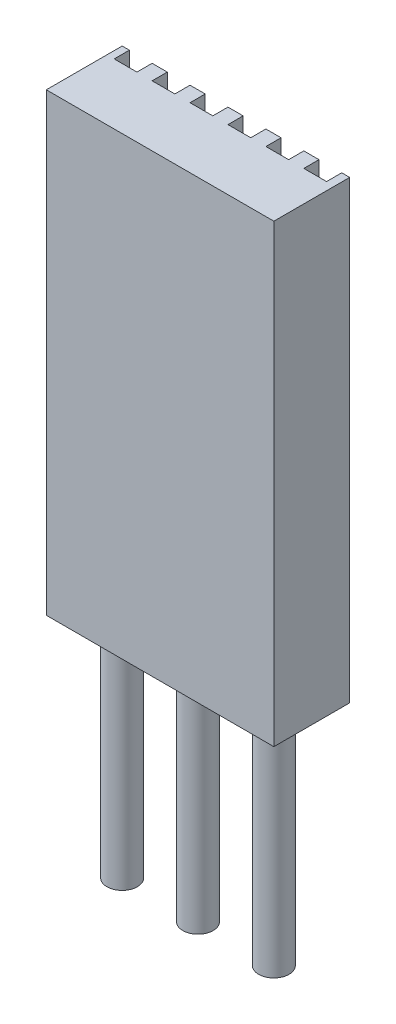
ISO-10303-21;
HEADER;
FILE_DESCRIPTION(('STEP AP214'),'2;1');
FILE_NAME('part.step','',(''),(''),'','','');
FILE_SCHEMA(('AUTOMOTIVE_DESIGN { 1 0 10303 214 1 1 1 1 }'));
ENDSEC;
DATA;
#1=APPLICATION_CONTEXT('core data for automotive mechanical design processes');
#2=APPLICATION_PROTOCOL_DEFINITION('international standard','automotive_design',2000,#1);
#3=PRODUCT_CONTEXT('',#1,'mechanical');
#4=PRODUCT('Part','Part','',(#3));
#5=PRODUCT_RELATED_PRODUCT_CATEGORY('part','',(#4));
#6=PRODUCT_DEFINITION_FORMATION('','',#4);
#7=PRODUCT_DEFINITION_CONTEXT('part definition',#1,'design');
#8=PRODUCT_DEFINITION('design','',#6,#7);
#9=PRODUCT_DEFINITION_SHAPE('','',#8);
#10=(LENGTH_UNIT() NAMED_UNIT(*) SI_UNIT(.MILLI.,.METRE.));
#11=(NAMED_UNIT(*) PLANE_ANGLE_UNIT() SI_UNIT($,.RADIAN.));
#12=(NAMED_UNIT(*) SI_UNIT($,.STERADIAN.) SOLID_ANGLE_UNIT());
#13=UNCERTAINTY_MEASURE_WITH_UNIT(LENGTH_MEASURE(1.E-05),#10,'distance_accuracy_value','');
#14=(GEOMETRIC_REPRESENTATION_CONTEXT(3) GLOBAL_UNCERTAINTY_ASSIGNED_CONTEXT((#13)) GLOBAL_UNIT_ASSIGNED_CONTEXT((#10,
#11,#12)) REPRESENTATION_CONTEXT('',''));
#15=CARTESIAN_POINT('',(0.,0.,0.));
#16=DIRECTION('',(0.,0.,1.));
#17=DIRECTION('',(1.,0.,0.));
#18=AXIS2_PLACEMENT_3D('',#15,#16,#17);
#19=CARTESIAN_POINT('',(15.,60.,-5.));
#20=DIRECTION('',(-1.,0.,0.));
#21=DIRECTION('',(0.,0.,1.));
#22=AXIS2_PLACEMENT_3D('',#19,#20,#21);
#23=PLANE('',#22);
#24=DIRECTION('',(0.,0.,-1.));
#25=VECTOR('',#24,1.);
#26=CARTESIAN_POINT('',(15.,0.,-5.));
#27=LINE('',#26,#25);
#28=CARTESIAN_POINT('',(15.,0.,5.));
#29=VERTEX_POINT('',#28);
#30=CARTESIAN_POINT('',(15.,0.,-5.));
#31=VERTEX_POINT('',#30);
#32=EDGE_CURVE('E262',#29,#31,#27,.T.);
#33=ORIENTED_EDGE('',*,*,#32,.T.);
#34=DIRECTION('',(0.,-1.,0.));
#35=VECTOR('',#34,1.);
#36=CARTESIAN_POINT('',(15.,60.,-5.));
#37=LINE('',#36,#35);
#38=CARTESIAN_POINT('',(15.,60.,-5.));
#39=VERTEX_POINT('',#38);
#40=EDGE_CURVE('E390',#39,#31,#37,.T.);
#41=ORIENTED_EDGE('',*,*,#40,.F.);
#42=DIRECTION('',(0.,0.,-1.));
#43=VECTOR('',#42,1.);
#44=CARTESIAN_POINT('',(15.,60.,-5.));
#45=LINE('',#44,#43);
#46=CARTESIAN_POINT('',(15.,60.,5.));
#47=VERTEX_POINT('',#46);
#48=EDGE_CURVE('E317',#47,#39,#45,.T.);
#49=ORIENTED_EDGE('',*,*,#48,.F.);
#50=DIRECTION('',(0.,-1.,0.));
#51=VECTOR('',#50,1.);
#52=CARTESIAN_POINT('',(15.,60.,5.));
#53=LINE('',#52,#51);
#54=EDGE_CURVE('E258',#47,#29,#53,.T.);
#55=ORIENTED_EDGE('',*,*,#54,.T.);
#56=EDGE_LOOP('',(#33,#41,#49,#55));
#57=FACE_BOUND('',#56,.T.);
#58=ADVANCED_FACE('F45',(#57),#23,.F.);
#59=CARTESIAN_POINT('',(13.9504003170093,60.,-5.));
#60=DIRECTION('',(0.,0.,1.));
#61=DIRECTION('',(1.,0.,0.));
#62=AXIS2_PLACEMENT_3D('',#59,#60,#61);
#63=PLANE('',#62);
#64=DIRECTION('',(-1.,0.,0.));
#65=VECTOR('',#64,1.);
#66=CARTESIAN_POINT('',(13.9504003170093,0.,-5.));
#67=LINE('',#66,#65);
#68=CARTESIAN_POINT('',(13.9504003170093,0.,-5.));
#69=VERTEX_POINT('',#68);
#70=EDGE_CURVE('E265',#31,#69,#67,.T.);
#71=ORIENTED_EDGE('',*,*,#70,.T.);
#72=DIRECTION('',(0.,-1.,0.));
#73=VECTOR('',#72,1.);
#74=CARTESIAN_POINT('',(13.9504003170093,60.,-5.));
#75=LINE('',#74,#73);
#76=CARTESIAN_POINT('',(13.9504003170093,60.,-5.));
#77=VERTEX_POINT('',#76);
#78=EDGE_CURVE('E387',#77,#69,#75,.T.);
#79=ORIENTED_EDGE('',*,*,#78,.F.);
#80=DIRECTION('',(-1.,0.,0.));
#81=VECTOR('',#80,1.);
#82=CARTESIAN_POINT('',(13.9504003170093,60.,-5.));
#83=LINE('',#82,#81);
#84=EDGE_CURVE('E165',#39,#77,#83,.T.);
#85=ORIENTED_EDGE('',*,*,#84,.F.);
#86=ORIENTED_EDGE('',*,*,#40,.T.);
#87=EDGE_LOOP('',(#71,#79,#85,#86));
#88=FACE_BOUND('',#87,.T.);
#89=ADVANCED_FACE('F422',(#88),#63,.F.);
#90=CARTESIAN_POINT('',(13.9504003170093,60.,-5.));
#91=DIRECTION('',(1.,0.,0.));
#92=DIRECTION('',(0.,0.,-1.));
#93=AXIS2_PLACEMENT_3D('',#90,#91,#92);
#94=PLANE('',#93);
#95=DIRECTION('',(0.,0.,1.));
#96=VECTOR('',#95,1.);
#97=CARTESIAN_POINT('',(13.9504003170093,0.,-5.));
#98=LINE('',#97,#96);
#99=CARTESIAN_POINT('',(13.9504003170093,0.,-3.));
#100=VERTEX_POINT('',#99);
#101=EDGE_CURVE('E268',#69,#100,#98,.T.);
#102=ORIENTED_EDGE('',*,*,#101,.T.);
#103=DIRECTION('',(0.,-1.,0.));
#104=VECTOR('',#103,1.);
#105=CARTESIAN_POINT('',(13.9504003170093,60.,-3.));
#106=LINE('',#105,#104);
#107=CARTESIAN_POINT('',(13.9504003170093,60.,-3.));
#108=VERTEX_POINT('',#107);
#109=EDGE_CURVE('E384',#108,#100,#106,.T.);
#110=ORIENTED_EDGE('',*,*,#109,.F.);
#111=DIRECTION('',(0.,0.,1.));
#112=VECTOR('',#111,1.);
#113=CARTESIAN_POINT('',(13.9504003170093,60.,-5.));
#114=LINE('',#113,#112);
#115=EDGE_CURVE('E657',#77,#108,#114,.T.);
#116=ORIENTED_EDGE('',*,*,#115,.F.);
#117=ORIENTED_EDGE('',*,*,#78,.T.);
#118=EDGE_LOOP('',(#102,#110,#116,#117));
#119=FACE_BOUND('',#118,.T.);
#120=ADVANCED_FACE('F426',(#119),#94,.F.);
#121=CARTESIAN_POINT('',(10.9504003170093,60.,-3.));
#122=DIRECTION('',(0.,0.,1.));
#123=DIRECTION('',(1.,0.,0.));
#124=AXIS2_PLACEMENT_3D('',#121,#122,#123);
#125=PLANE('',#124);
#126=DIRECTION('',(-1.,0.,0.));
#127=VECTOR('',#126,1.);
#128=CARTESIAN_POINT('',(10.9504003170093,0.,-3.));
#129=LINE('',#128,#127);
#130=CARTESIAN_POINT('',(10.9504003170093,0.,-3.));
#131=VERTEX_POINT('',#130);
#132=EDGE_CURVE('E270',#100,#131,#129,.T.);
#133=ORIENTED_EDGE('',*,*,#132,.T.);
#134=DIRECTION('',(0.,-1.,0.));
#135=VECTOR('',#134,1.);
#136=CARTESIAN_POINT('',(10.9504003170093,60.,-3.));
#137=LINE('',#136,#135);
#138=CARTESIAN_POINT('',(10.9504003170093,60.,-3.));
#139=VERTEX_POINT('',#138);
#140=EDGE_CURVE('E381',#139,#131,#137,.T.);
#141=ORIENTED_EDGE('',*,*,#140,.F.);
#142=DIRECTION('',(-1.,0.,0.));
#143=VECTOR('',#142,1.);
#144=CARTESIAN_POINT('',(10.9504003170093,60.,-3.));
#145=LINE('',#144,#143);
#146=EDGE_CURVE('E659',#108,#139,#145,.T.);
#147=ORIENTED_EDGE('',*,*,#146,.F.);
#148=ORIENTED_EDGE('',*,*,#109,.T.);
#149=EDGE_LOOP('',(#133,#141,#147,#148));
#150=FACE_BOUND('',#149,.T.);
#151=ADVANCED_FACE('F430',(#150),#125,.F.);
#152=CARTESIAN_POINT('',(10.9504003170093,60.,-5.));
#153=DIRECTION('',(-1.,0.,0.));
#154=DIRECTION('',(0.,0.,1.));
#155=AXIS2_PLACEMENT_3D('',#152,#153,#154);
#156=PLANE('',#155);
#157=DIRECTION('',(0.,0.,-1.));
#158=VECTOR('',#157,1.);
#159=CARTESIAN_POINT('',(10.9504003170093,0.,-5.));
#160=LINE('',#159,#158);
#161=CARTESIAN_POINT('',(10.9504003170093,0.,-5.));
#162=VERTEX_POINT('',#161);
#163=EDGE_CURVE('E272',#131,#162,#160,.T.);
#164=ORIENTED_EDGE('',*,*,#163,.T.);
#165=DIRECTION('',(0.,-1.,0.));
#166=VECTOR('',#165,1.);
#167=CARTESIAN_POINT('',(10.9504003170093,60.,-5.));
#168=LINE('',#167,#166);
#169=CARTESIAN_POINT('',(10.9504003170093,60.,-5.));
#170=VERTEX_POINT('',#169);
#171=EDGE_CURVE('E378',#170,#162,#168,.T.);
#172=ORIENTED_EDGE('',*,*,#171,.F.);
#173=DIRECTION('',(0.,0.,-1.));
#174=VECTOR('',#173,1.);
#175=CARTESIAN_POINT('',(10.9504003170093,60.,-5.));
#176=LINE('',#175,#174);
#177=EDGE_CURVE('E661',#139,#170,#176,.T.);
#178=ORIENTED_EDGE('',*,*,#177,.F.);
#179=ORIENTED_EDGE('',*,*,#140,.T.);
#180=EDGE_LOOP('',(#164,#172,#178,#179));
#181=FACE_BOUND('',#180,.T.);
#182=ADVANCED_FACE('F436',(#181),#156,.F.);
#183=CARTESIAN_POINT('',(8.95040031700933,60.,-5.));
#184=DIRECTION('',(0.,0.,1.));
#185=DIRECTION('',(1.,0.,0.));
#186=AXIS2_PLACEMENT_3D('',#183,#184,#185);
#187=PLANE('',#186);
#188=DIRECTION('',(-1.,0.,0.));
#189=VECTOR('',#188,1.);
#190=CARTESIAN_POINT('',(8.95040031700933,0.,-5.));
#191=LINE('',#190,#189);
#192=CARTESIAN_POINT('',(8.95040031700933,0.,-5.));
#193=VERTEX_POINT('',#192);
#194=EDGE_CURVE('E274',#162,#193,#191,.T.);
#195=ORIENTED_EDGE('',*,*,#194,.T.);
#196=DIRECTION('',(0.,-1.,0.));
#197=VECTOR('',#196,1.);
#198=CARTESIAN_POINT('',(8.95040031700933,60.,-5.));
#199=LINE('',#198,#197);
#200=CARTESIAN_POINT('',(8.95040031700933,60.,-5.));
#201=VERTEX_POINT('',#200);
#202=EDGE_CURVE('E375',#201,#193,#199,.T.);
#203=ORIENTED_EDGE('',*,*,#202,.F.);
#204=DIRECTION('',(-1.,0.,0.));
#205=VECTOR('',#204,1.);
#206=CARTESIAN_POINT('',(8.95040031700933,60.,-5.));
#207=LINE('',#206,#205);
#208=EDGE_CURVE('E663',#170,#201,#207,.T.);
#209=ORIENTED_EDGE('',*,*,#208,.F.);
#210=ORIENTED_EDGE('',*,*,#171,.T.);
#211=EDGE_LOOP('',(#195,#203,#209,#210));
#212=FACE_BOUND('',#211,.T.);
#213=ADVANCED_FACE('F440',(#212),#187,.F.);
#214=CARTESIAN_POINT('',(8.95040031700933,60.,-5.));
#215=DIRECTION('',(1.,0.,0.));
#216=DIRECTION('',(0.,0.,-1.));
#217=AXIS2_PLACEMENT_3D('',#214,#215,#216);
#218=PLANE('',#217);
#219=DIRECTION('',(0.,0.,1.));
#220=VECTOR('',#219,1.);
#221=CARTESIAN_POINT('',(8.95040031700933,0.,-5.));
#222=LINE('',#221,#220);
#223=CARTESIAN_POINT('',(8.95040031700933,0.,-3.));
#224=VERTEX_POINT('',#223);
#225=EDGE_CURVE('E276',#193,#224,#222,.T.);
#226=ORIENTED_EDGE('',*,*,#225,.T.);
#227=DIRECTION('',(0.,-1.,0.));
#228=VECTOR('',#227,1.);
#229=CARTESIAN_POINT('',(8.95040031700933,60.,-3.));
#230=LINE('',#229,#228);
#231=CARTESIAN_POINT('',(8.95040031700933,60.,-3.));
#232=VERTEX_POINT('',#231);
#233=EDGE_CURVE('E372',#232,#224,#230,.T.);
#234=ORIENTED_EDGE('',*,*,#233,.F.);
#235=DIRECTION('',(0.,0.,1.));
#236=VECTOR('',#235,1.);
#237=CARTESIAN_POINT('',(8.95040031700933,60.,-5.));
#238=LINE('',#237,#236);
#239=EDGE_CURVE('E665',#201,#232,#238,.T.);
#240=ORIENTED_EDGE('',*,*,#239,.F.);
#241=ORIENTED_EDGE('',*,*,#202,.T.);
#242=EDGE_LOOP('',(#226,#234,#240,#241));
#243=FACE_BOUND('',#242,.T.);
#244=ADVANCED_FACE('F444',(#243),#218,.F.);
#245=CARTESIAN_POINT('',(5.95040031700933,60.,-3.));
#246=DIRECTION('',(0.,0.,1.));
#247=DIRECTION('',(1.,0.,0.));
#248=AXIS2_PLACEMENT_3D('',#245,#246,#247);
#249=PLANE('',#248);
#250=DIRECTION('',(-1.,0.,0.));
#251=VECTOR('',#250,1.);
#252=CARTESIAN_POINT('',(5.95040031700933,0.,-3.));
#253=LINE('',#252,#251);
#254=CARTESIAN_POINT('',(5.95040031700933,0.,-3.));
#255=VERTEX_POINT('',#254);
#256=EDGE_CURVE('E278',#224,#255,#253,.T.);
#257=ORIENTED_EDGE('',*,*,#256,.T.);
#258=DIRECTION('',(0.,-1.,0.));
#259=VECTOR('',#258,1.);
#260=CARTESIAN_POINT('',(5.95040031700933,60.,-3.));
#261=LINE('',#260,#259);
#262=CARTESIAN_POINT('',(5.95040031700933,60.,-3.));
#263=VERTEX_POINT('',#262);
#264=EDGE_CURVE('E369',#263,#255,#261,.T.);
#265=ORIENTED_EDGE('',*,*,#264,.F.);
#266=DIRECTION('',(-1.,0.,0.));
#267=VECTOR('',#266,1.);
#268=CARTESIAN_POINT('',(5.95040031700933,60.,-3.));
#269=LINE('',#268,#267);
#270=EDGE_CURVE('E667',#232,#263,#269,.T.);
#271=ORIENTED_EDGE('',*,*,#270,.F.);
#272=ORIENTED_EDGE('',*,*,#233,.T.);
#273=EDGE_LOOP('',(#257,#265,#271,#272));
#274=FACE_BOUND('',#273,.T.);
#275=ADVANCED_FACE('F448',(#274),#249,.F.);
#276=CARTESIAN_POINT('',(5.95040031700933,60.,-5.));
#277=DIRECTION('',(-1.,0.,0.));
#278=DIRECTION('',(0.,0.,1.));
#279=AXIS2_PLACEMENT_3D('',#276,#277,#278);
#280=PLANE('',#279);
#281=DIRECTION('',(0.,0.,-1.));
#282=VECTOR('',#281,1.);
#283=CARTESIAN_POINT('',(5.95040031700933,0.,-5.));
#284=LINE('',#283,#282);
#285=CARTESIAN_POINT('',(5.95040031700933,0.,-5.));
#286=VERTEX_POINT('',#285);
#287=EDGE_CURVE('E280',#255,#286,#284,.T.);
#288=ORIENTED_EDGE('',*,*,#287,.T.);
#289=DIRECTION('',(0.,-1.,0.));
#290=VECTOR('',#289,1.);
#291=CARTESIAN_POINT('',(5.95040031700933,60.,-5.));
#292=LINE('',#291,#290);
#293=CARTESIAN_POINT('',(5.95040031700933,60.,-5.));
#294=VERTEX_POINT('',#293);
#295=EDGE_CURVE('E366',#294,#286,#292,.T.);
#296=ORIENTED_EDGE('',*,*,#295,.F.);
#297=DIRECTION('',(0.,0.,-1.));
#298=VECTOR('',#297,1.);
#299=CARTESIAN_POINT('',(5.95040031700933,60.,-5.));
#300=LINE('',#299,#298);
#301=EDGE_CURVE('E669',#263,#294,#300,.T.);
#302=ORIENTED_EDGE('',*,*,#301,.F.);
#303=ORIENTED_EDGE('',*,*,#264,.T.);
#304=EDGE_LOOP('',(#288,#296,#302,#303));
#305=FACE_BOUND('',#304,.T.);
#306=ADVANCED_FACE('F452',(#305),#280,.F.);
#307=CARTESIAN_POINT('',(3.95040031700933,60.,-5.));
#308=DIRECTION('',(0.,0.,1.));
#309=DIRECTION('',(1.,0.,0.));
#310=AXIS2_PLACEMENT_3D('',#307,#308,#309);
#311=PLANE('',#310);
#312=DIRECTION('',(-1.,0.,0.));
#313=VECTOR('',#312,1.);
#314=CARTESIAN_POINT('',(3.95040031700933,0.,-5.));
#315=LINE('',#314,#313);
#316=CARTESIAN_POINT('',(3.95040031700933,0.,-5.));
#317=VERTEX_POINT('',#316);
#318=EDGE_CURVE('E282',#286,#317,#315,.T.);
#319=ORIENTED_EDGE('',*,*,#318,.T.);
#320=DIRECTION('',(0.,-1.,0.));
#321=VECTOR('',#320,1.);
#322=CARTESIAN_POINT('',(3.95040031700933,60.,-5.));
#323=LINE('',#322,#321);
#324=CARTESIAN_POINT('',(3.95040031700933,60.,-5.));
#325=VERTEX_POINT('',#324);
#326=EDGE_CURVE('E363',#325,#317,#323,.T.);
#327=ORIENTED_EDGE('',*,*,#326,.F.);
#328=DIRECTION('',(-1.,0.,0.));
#329=VECTOR('',#328,1.);
#330=CARTESIAN_POINT('',(3.95040031700933,60.,-5.));
#331=LINE('',#330,#329);
#332=EDGE_CURVE('E671',#294,#325,#331,.T.);
#333=ORIENTED_EDGE('',*,*,#332,.F.);
#334=ORIENTED_EDGE('',*,*,#295,.T.);
#335=EDGE_LOOP('',(#319,#327,#333,#334));
#336=FACE_BOUND('',#335,.T.);
#337=ADVANCED_FACE('F456',(#336),#311,.F.);
#338=CARTESIAN_POINT('',(3.95040031700933,60.,-5.));
#339=DIRECTION('',(1.,0.,0.));
#340=DIRECTION('',(0.,0.,-1.));
#341=AXIS2_PLACEMENT_3D('',#338,#339,#340);
#342=PLANE('',#341);
#343=DIRECTION('',(0.,0.,1.));
#344=VECTOR('',#343,1.);
#345=CARTESIAN_POINT('',(3.95040031700933,0.,-5.));
#346=LINE('',#345,#344);
#347=CARTESIAN_POINT('',(3.95040031700933,0.,-3.));
#348=VERTEX_POINT('',#347);
#349=EDGE_CURVE('E284',#317,#348,#346,.T.);
#350=ORIENTED_EDGE('',*,*,#349,.T.);
#351=DIRECTION('',(0.,-1.,0.));
#352=VECTOR('',#351,1.);
#353=CARTESIAN_POINT('',(3.95040031700933,60.,-3.));
#354=LINE('',#353,#352);
#355=CARTESIAN_POINT('',(3.95040031700933,60.,-3.));
#356=VERTEX_POINT('',#355);
#357=EDGE_CURVE('E360',#356,#348,#354,.T.);
#358=ORIENTED_EDGE('',*,*,#357,.F.);
#359=DIRECTION('',(0.,0.,1.));
#360=VECTOR('',#359,1.);
#361=CARTESIAN_POINT('',(3.95040031700933,60.,-5.));
#362=LINE('',#361,#360);
#363=EDGE_CURVE('E673',#325,#356,#362,.T.);
#364=ORIENTED_EDGE('',*,*,#363,.F.);
#365=ORIENTED_EDGE('',*,*,#326,.T.);
#366=EDGE_LOOP('',(#350,#358,#364,#365));
#367=FACE_BOUND('',#366,.T.);
#368=ADVANCED_FACE('F460',(#367),#342,.F.);
#369=CARTESIAN_POINT('',(0.950400317009329,60.,-3.));
#370=DIRECTION('',(0.,0.,1.));
#371=DIRECTION('',(1.,0.,0.));
#372=AXIS2_PLACEMENT_3D('',#369,#370,#371);
#373=PLANE('',#372);
#374=DIRECTION('',(-1.,0.,0.));
#375=VECTOR('',#374,1.);
#376=CARTESIAN_POINT('',(0.950400317009329,0.,-3.));
#377=LINE('',#376,#375);
#378=CARTESIAN_POINT('',(0.950400317009329,0.,-3.));
#379=VERTEX_POINT('',#378);
#380=EDGE_CURVE('E286',#348,#379,#377,.T.);
#381=ORIENTED_EDGE('',*,*,#380,.T.);
#382=DIRECTION('',(0.,-1.,0.));
#383=VECTOR('',#382,1.);
#384=CARTESIAN_POINT('',(0.950400317009329,60.,-3.));
#385=LINE('',#384,#383);
#386=CARTESIAN_POINT('',(0.950400317009329,60.,-3.));
#387=VERTEX_POINT('',#386);
#388=EDGE_CURVE('E357',#387,#379,#385,.T.);
#389=ORIENTED_EDGE('',*,*,#388,.F.);
#390=DIRECTION('',(-1.,0.,0.));
#391=VECTOR('',#390,1.);
#392=CARTESIAN_POINT('',(0.950400317009329,60.,-3.));
#393=LINE('',#392,#391);
#394=EDGE_CURVE('E675',#356,#387,#393,.T.);
#395=ORIENTED_EDGE('',*,*,#394,.F.);
#396=ORIENTED_EDGE('',*,*,#357,.T.);
#397=EDGE_LOOP('',(#381,#389,#395,#396));
#398=FACE_BOUND('',#397,.T.);
#399=ADVANCED_FACE('F464',(#398),#373,.F.);
#400=CARTESIAN_POINT('',(0.950400317009329,60.,-5.));
#401=DIRECTION('',(-1.,0.,0.));
#402=DIRECTION('',(0.,0.,1.));
#403=AXIS2_PLACEMENT_3D('',#400,#401,#402);
#404=PLANE('',#403);
#405=DIRECTION('',(0.,0.,-1.));
#406=VECTOR('',#405,1.);
#407=CARTESIAN_POINT('',(0.950400317009329,0.,-5.));
#408=LINE('',#407,#406);
#409=CARTESIAN_POINT('',(0.950400317009329,0.,-5.));
#410=VERTEX_POINT('',#409);
#411=EDGE_CURVE('E288',#379,#410,#408,.T.);
#412=ORIENTED_EDGE('',*,*,#411,.T.);
#413=DIRECTION('',(0.,-1.,0.));
#414=VECTOR('',#413,1.);
#415=CARTESIAN_POINT('',(0.950400317009329,60.,-5.));
#416=LINE('',#415,#414);
#417=CARTESIAN_POINT('',(0.950400317009329,60.,-5.));
#418=VERTEX_POINT('',#417);
#419=EDGE_CURVE('E354',#418,#410,#416,.T.);
#420=ORIENTED_EDGE('',*,*,#419,.F.);
#421=DIRECTION('',(0.,0.,-1.));
#422=VECTOR('',#421,1.);
#423=CARTESIAN_POINT('',(0.950400317009329,60.,-5.));
#424=LINE('',#423,#422);
#425=EDGE_CURVE('E677',#387,#418,#424,.T.);
#426=ORIENTED_EDGE('',*,*,#425,.F.);
#427=ORIENTED_EDGE('',*,*,#388,.T.);
#428=EDGE_LOOP('',(#412,#420,#426,#427));
#429=FACE_BOUND('',#428,.T.);
#430=ADVANCED_FACE('F468',(#429),#404,.F.);
#431=CARTESIAN_POINT('',(-1.04959968299067,60.,-5.));
#432=DIRECTION('',(0.,0.,1.));
#433=DIRECTION('',(1.,0.,0.));
#434=AXIS2_PLACEMENT_3D('',#431,#432,#433);
#435=PLANE('',#434);
#436=DIRECTION('',(-1.,0.,0.));
#437=VECTOR('',#436,1.);
#438=CARTESIAN_POINT('',(-1.04959968299067,0.,-5.));
#439=LINE('',#438,#437);
#440=CARTESIAN_POINT('',(-1.04959968299067,0.,-5.));
#441=VERTEX_POINT('',#440);
#442=EDGE_CURVE('E290',#410,#441,#439,.T.);
#443=ORIENTED_EDGE('',*,*,#442,.T.);
#444=DIRECTION('',(0.,-1.,0.));
#445=VECTOR('',#444,1.);
#446=CARTESIAN_POINT('',(-1.04959968299067,60.,-5.));
#447=LINE('',#446,#445);
#448=CARTESIAN_POINT('',(-1.04959968299067,60.,-5.));
#449=VERTEX_POINT('',#448);
#450=EDGE_CURVE('E351',#449,#441,#447,.T.);
#451=ORIENTED_EDGE('',*,*,#450,.F.);
#452=DIRECTION('',(-1.,0.,0.));
#453=VECTOR('',#452,1.);
#454=CARTESIAN_POINT('',(-1.04959968299067,60.,-5.));
#455=LINE('',#454,#453);
#456=EDGE_CURVE('E679',#418,#449,#455,.T.);
#457=ORIENTED_EDGE('',*,*,#456,.F.);
#458=ORIENTED_EDGE('',*,*,#419,.T.);
#459=EDGE_LOOP('',(#443,#451,#457,#458));
#460=FACE_BOUND('',#459,.T.);
#461=ADVANCED_FACE('F472',(#460),#435,.F.);
#462=CARTESIAN_POINT('',(-1.04959968299067,60.,-5.));
#463=DIRECTION('',(1.,0.,0.));
#464=DIRECTION('',(0.,0.,-1.));
#465=AXIS2_PLACEMENT_3D('',#462,#463,#464);
#466=PLANE('',#465);
#467=DIRECTION('',(0.,0.,1.));
#468=VECTOR('',#467,1.);
#469=CARTESIAN_POINT('',(-1.04959968299067,0.,-5.));
#470=LINE('',#469,#468);
#471=CARTESIAN_POINT('',(-1.04959968299067,0.,-3.));
#472=VERTEX_POINT('',#471);
#473=EDGE_CURVE('E292',#441,#472,#470,.T.);
#474=ORIENTED_EDGE('',*,*,#473,.T.);
#475=DIRECTION('',(0.,-1.,0.));
#476=VECTOR('',#475,1.);
#477=CARTESIAN_POINT('',(-1.04959968299067,60.,-3.));
#478=LINE('',#477,#476);
#479=CARTESIAN_POINT('',(-1.04959968299067,60.,-3.));
#480=VERTEX_POINT('',#479);
#481=EDGE_CURVE('E348',#480,#472,#478,.T.);
#482=ORIENTED_EDGE('',*,*,#481,.F.);
#483=DIRECTION('',(0.,0.,1.));
#484=VECTOR('',#483,1.);
#485=CARTESIAN_POINT('',(-1.04959968299067,60.,-5.));
#486=LINE('',#485,#484);
#487=EDGE_CURVE('E681',#449,#480,#486,.T.);
#488=ORIENTED_EDGE('',*,*,#487,.F.);
#489=ORIENTED_EDGE('',*,*,#450,.T.);
#490=EDGE_LOOP('',(#474,#482,#488,#489));
#491=FACE_BOUND('',#490,.T.);
#492=ADVANCED_FACE('F476',(#491),#466,.F.);
#493=CARTESIAN_POINT('',(-4.04959968299067,60.,-3.));
#494=DIRECTION('',(0.,0.,1.));
#495=DIRECTION('',(1.,0.,0.));
#496=AXIS2_PLACEMENT_3D('',#493,#494,#495);
#497=PLANE('',#496);
#498=DIRECTION('',(-1.,0.,0.));
#499=VECTOR('',#498,1.);
#500=CARTESIAN_POINT('',(-4.04959968299067,0.,-3.));
#501=LINE('',#500,#499);
#502=CARTESIAN_POINT('',(-4.04959968299067,0.,-3.));
#503=VERTEX_POINT('',#502);
#504=EDGE_CURVE('E294',#472,#503,#501,.T.);
#505=ORIENTED_EDGE('',*,*,#504,.T.);
#506=DIRECTION('',(0.,-1.,0.));
#507=VECTOR('',#506,1.);
#508=CARTESIAN_POINT('',(-4.04959968299067,60.,-3.));
#509=LINE('',#508,#507);
#510=CARTESIAN_POINT('',(-4.04959968299067,60.,-3.));
#511=VERTEX_POINT('',#510);
#512=EDGE_CURVE('E345',#511,#503,#509,.T.);
#513=ORIENTED_EDGE('',*,*,#512,.F.);
#514=DIRECTION('',(-1.,0.,0.));
#515=VECTOR('',#514,1.);
#516=CARTESIAN_POINT('',(-4.04959968299067,60.,-3.));
#517=LINE('',#516,#515);
#518=EDGE_CURVE('E683',#480,#511,#517,.T.);
#519=ORIENTED_EDGE('',*,*,#518,.F.);
#520=ORIENTED_EDGE('',*,*,#481,.T.);
#521=EDGE_LOOP('',(#505,#513,#519,#520));
#522=FACE_BOUND('',#521,.T.);
#523=ADVANCED_FACE('F480',(#522),#497,.F.);
#524=CARTESIAN_POINT('',(-4.04959968299067,60.,-5.));
#525=DIRECTION('',(-1.,0.,0.));
#526=DIRECTION('',(0.,0.,1.));
#527=AXIS2_PLACEMENT_3D('',#524,#525,#526);
#528=PLANE('',#527);
#529=DIRECTION('',(0.,0.,-1.));
#530=VECTOR('',#529,1.);
#531=CARTESIAN_POINT('',(-4.04959968299067,0.,-5.));
#532=LINE('',#531,#530);
#533=CARTESIAN_POINT('',(-4.04959968299067,0.,-5.));
#534=VERTEX_POINT('',#533);
#535=EDGE_CURVE('E296',#503,#534,#532,.T.);
#536=ORIENTED_EDGE('',*,*,#535,.T.);
#537=DIRECTION('',(0.,-1.,0.));
#538=VECTOR('',#537,1.);
#539=CARTESIAN_POINT('',(-4.04959968299067,60.,-5.));
#540=LINE('',#539,#538);
#541=CARTESIAN_POINT('',(-4.04959968299067,60.,-5.));
#542=VERTEX_POINT('',#541);
#543=EDGE_CURVE('E342',#542,#534,#540,.T.);
#544=ORIENTED_EDGE('',*,*,#543,.F.);
#545=DIRECTION('',(0.,0.,-1.));
#546=VECTOR('',#545,1.);
#547=CARTESIAN_POINT('',(-4.04959968299067,60.,-5.));
#548=LINE('',#547,#546);
#549=EDGE_CURVE('E685',#511,#542,#548,.T.);
#550=ORIENTED_EDGE('',*,*,#549,.F.);
#551=ORIENTED_EDGE('',*,*,#512,.T.);
#552=EDGE_LOOP('',(#536,#544,#550,#551));
#553=FACE_BOUND('',#552,.T.);
#554=ADVANCED_FACE('F484',(#553),#528,.F.);
#555=CARTESIAN_POINT('',(-6.04959968299067,60.,-5.));
#556=DIRECTION('',(0.,0.,1.));
#557=DIRECTION('',(1.,0.,0.));
#558=AXIS2_PLACEMENT_3D('',#555,#556,#557);
#559=PLANE('',#558);
#560=DIRECTION('',(-1.,0.,0.));
#561=VECTOR('',#560,1.);
#562=CARTESIAN_POINT('',(-6.04959968299067,0.,-5.));
#563=LINE('',#562,#561);
#564=CARTESIAN_POINT('',(-6.04959968299067,0.,-5.));
#565=VERTEX_POINT('',#564);
#566=EDGE_CURVE('E298',#534,#565,#563,.T.);
#567=ORIENTED_EDGE('',*,*,#566,.T.);
#568=DIRECTION('',(0.,-1.,0.));
#569=VECTOR('',#568,1.);
#570=CARTESIAN_POINT('',(-6.04959968299067,60.,-5.));
#571=LINE('',#570,#569);
#572=CARTESIAN_POINT('',(-6.04959968299067,60.,-5.));
#573=VERTEX_POINT('',#572);
#574=EDGE_CURVE('E339',#573,#565,#571,.T.);
#575=ORIENTED_EDGE('',*,*,#574,.F.);
#576=DIRECTION('',(-1.,0.,0.));
#577=VECTOR('',#576,1.);
#578=CARTESIAN_POINT('',(-6.04959968299067,60.,-5.));
#579=LINE('',#578,#577);
#580=EDGE_CURVE('E687',#542,#573,#579,.T.);
#581=ORIENTED_EDGE('',*,*,#580,.F.);
#582=ORIENTED_EDGE('',*,*,#543,.T.);
#583=EDGE_LOOP('',(#567,#575,#581,#582));
#584=FACE_BOUND('',#583,.T.);
#585=ADVANCED_FACE('F488',(#584),#559,.F.);
#586=CARTESIAN_POINT('',(-6.04959968299067,60.,-5.));
#587=DIRECTION('',(1.,0.,0.));
#588=DIRECTION('',(0.,0.,-1.));
#589=AXIS2_PLACEMENT_3D('',#586,#587,#588);
#590=PLANE('',#589);
#591=DIRECTION('',(0.,0.,1.));
#592=VECTOR('',#591,1.);
#593=CARTESIAN_POINT('',(-6.04959968299067,0.,-5.));
#594=LINE('',#593,#592);
#595=CARTESIAN_POINT('',(-6.04959968299067,0.,-3.));
#596=VERTEX_POINT('',#595);
#597=EDGE_CURVE('E300',#565,#596,#594,.T.);
#598=ORIENTED_EDGE('',*,*,#597,.T.);
#599=DIRECTION('',(0.,-1.,0.));
#600=VECTOR('',#599,1.);
#601=CARTESIAN_POINT('',(-6.04959968299067,60.,-3.));
#602=LINE('',#601,#600);
#603=CARTESIAN_POINT('',(-6.04959968299067,60.,-3.));
#604=VERTEX_POINT('',#603);
#605=EDGE_CURVE('E336',#604,#596,#602,.T.);
#606=ORIENTED_EDGE('',*,*,#605,.F.);
#607=DIRECTION('',(0.,0.,1.));
#608=VECTOR('',#607,1.);
#609=CARTESIAN_POINT('',(-6.04959968299067,60.,-5.));
#610=LINE('',#609,#608);
#611=EDGE_CURVE('E689',#573,#604,#610,.T.);
#612=ORIENTED_EDGE('',*,*,#611,.F.);
#613=ORIENTED_EDGE('',*,*,#574,.T.);
#614=EDGE_LOOP('',(#598,#606,#612,#613));
#615=FACE_BOUND('',#614,.T.);
#616=ADVANCED_FACE('F492',(#615),#590,.F.);
#617=CARTESIAN_POINT('',(-9.04959968299067,60.,-3.));
#618=DIRECTION('',(0.,0.,1.));
#619=DIRECTION('',(1.,0.,0.));
#620=AXIS2_PLACEMENT_3D('',#617,#618,#619);
#621=PLANE('',#620);
#622=DIRECTION('',(-1.,0.,0.));
#623=VECTOR('',#622,1.);
#624=CARTESIAN_POINT('',(-9.04959968299067,0.,-3.));
#625=LINE('',#624,#623);
#626=CARTESIAN_POINT('',(-9.04959968299067,0.,-3.));
#627=VERTEX_POINT('',#626);
#628=EDGE_CURVE('E302',#596,#627,#625,.T.);
#629=ORIENTED_EDGE('',*,*,#628,.T.);
#630=DIRECTION('',(0.,-1.,0.));
#631=VECTOR('',#630,1.);
#632=CARTESIAN_POINT('',(-9.04959968299067,60.,-3.));
#633=LINE('',#632,#631);
#634=CARTESIAN_POINT('',(-9.04959968299067,60.,-3.));
#635=VERTEX_POINT('',#634);
#636=EDGE_CURVE('E333',#635,#627,#633,.T.);
#637=ORIENTED_EDGE('',*,*,#636,.F.);
#638=DIRECTION('',(-1.,0.,0.));
#639=VECTOR('',#638,1.);
#640=CARTESIAN_POINT('',(-9.04959968299067,60.,-3.));
#641=LINE('',#640,#639);
#642=EDGE_CURVE('E691',#604,#635,#641,.T.);
#643=ORIENTED_EDGE('',*,*,#642,.F.);
#644=ORIENTED_EDGE('',*,*,#605,.T.);
#645=EDGE_LOOP('',(#629,#637,#643,#644));
#646=FACE_BOUND('',#645,.T.);
#647=ADVANCED_FACE('F496',(#646),#621,.F.);
#648=CARTESIAN_POINT('',(-9.04959968299067,60.,-5.));
#649=DIRECTION('',(-1.,0.,0.));
#650=DIRECTION('',(0.,0.,1.));
#651=AXIS2_PLACEMENT_3D('',#648,#649,#650);
#652=PLANE('',#651);
#653=DIRECTION('',(0.,0.,-1.));
#654=VECTOR('',#653,1.);
#655=CARTESIAN_POINT('',(-9.04959968299067,0.,-5.));
#656=LINE('',#655,#654);
#657=CARTESIAN_POINT('',(-9.04959968299067,0.,-5.));
#658=VERTEX_POINT('',#657);
#659=EDGE_CURVE('E304',#627,#658,#656,.T.);
#660=ORIENTED_EDGE('',*,*,#659,.T.);
#661=DIRECTION('',(0.,-1.,0.));
#662=VECTOR('',#661,1.);
#663=CARTESIAN_POINT('',(-9.04959968299067,60.,-5.));
#664=LINE('',#663,#662);
#665=CARTESIAN_POINT('',(-9.04959968299067,60.,-5.));
#666=VERTEX_POINT('',#665);
#667=EDGE_CURVE('E330',#666,#658,#664,.T.);
#668=ORIENTED_EDGE('',*,*,#667,.F.);
#669=DIRECTION('',(0.,0.,-1.));
#670=VECTOR('',#669,1.);
#671=CARTESIAN_POINT('',(-9.04959968299067,60.,-5.));
#672=LINE('',#671,#670);
#673=EDGE_CURVE('E693',#635,#666,#672,.T.);
#674=ORIENTED_EDGE('',*,*,#673,.F.);
#675=ORIENTED_EDGE('',*,*,#636,.T.);
#676=EDGE_LOOP('',(#660,#668,#674,#675));
#677=FACE_BOUND('',#676,.T.);
#678=ADVANCED_FACE('F500',(#677),#652,.F.);
#679=CARTESIAN_POINT('',(-11.0495996829907,60.,-5.));
#680=DIRECTION('',(0.,0.,1.));
#681=DIRECTION('',(1.,0.,0.));
#682=AXIS2_PLACEMENT_3D('',#679,#680,#681);
#683=PLANE('',#682);
#684=DIRECTION('',(-1.,0.,0.));
#685=VECTOR('',#684,1.);
#686=CARTESIAN_POINT('',(-11.0495996829907,0.,-5.));
#687=LINE('',#686,#685);
#688=CARTESIAN_POINT('',(-11.0495996829907,0.,-5.));
#689=VERTEX_POINT('',#688);
#690=EDGE_CURVE('E306',#658,#689,#687,.T.);
#691=ORIENTED_EDGE('',*,*,#690,.T.);
#692=DIRECTION('',(0.,-1.,0.));
#693=VECTOR('',#692,1.);
#694=CARTESIAN_POINT('',(-11.0495996829907,60.,-5.));
#695=LINE('',#694,#693);
#696=CARTESIAN_POINT('',(-11.0495996829907,60.,-5.));
#697=VERTEX_POINT('',#696);
#698=EDGE_CURVE('E327',#697,#689,#695,.T.);
#699=ORIENTED_EDGE('',*,*,#698,.F.);
#700=DIRECTION('',(-1.,0.,0.));
#701=VECTOR('',#700,1.);
#702=CARTESIAN_POINT('',(-11.0495996829907,60.,-5.));
#703=LINE('',#702,#701);
#704=EDGE_CURVE('E695',#666,#697,#703,.T.);
#705=ORIENTED_EDGE('',*,*,#704,.F.);
#706=ORIENTED_EDGE('',*,*,#667,.T.);
#707=EDGE_LOOP('',(#691,#699,#705,#706));
#708=FACE_BOUND('',#707,.T.);
#709=ADVANCED_FACE('F504',(#708),#683,.F.);
#710=CARTESIAN_POINT('',(-11.0495996829907,60.,-5.));
#711=DIRECTION('',(1.,0.,0.));
#712=DIRECTION('',(0.,0.,-1.));
#713=AXIS2_PLACEMENT_3D('',#710,#711,#712);
#714=PLANE('',#713);
#715=DIRECTION('',(0.,0.,1.));
#716=VECTOR('',#715,1.);
#717=CARTESIAN_POINT('',(-11.0495996829907,0.,-5.));
#718=LINE('',#717,#716);
#719=CARTESIAN_POINT('',(-11.0495996829907,0.,-3.));
#720=VERTEX_POINT('',#719);
#721=EDGE_CURVE('E308',#689,#720,#718,.T.);
#722=ORIENTED_EDGE('',*,*,#721,.T.);
#723=DIRECTION('',(0.,-1.,0.));
#724=VECTOR('',#723,1.);
#725=CARTESIAN_POINT('',(-11.0495996829907,60.,-3.));
#726=LINE('',#725,#724);
#727=CARTESIAN_POINT('',(-11.0495996829907,60.,-3.));
#728=VERTEX_POINT('',#727);
#729=EDGE_CURVE('E324',#728,#720,#726,.T.);
#730=ORIENTED_EDGE('',*,*,#729,.F.);
#731=DIRECTION('',(0.,0.,1.));
#732=VECTOR('',#731,1.);
#733=CARTESIAN_POINT('',(-11.0495996829907,60.,-5.));
#734=LINE('',#733,#732);
#735=EDGE_CURVE('E697',#697,#728,#734,.T.);
#736=ORIENTED_EDGE('',*,*,#735,.F.);
#737=ORIENTED_EDGE('',*,*,#698,.T.);
#738=EDGE_LOOP('',(#722,#730,#736,#737));
#739=FACE_BOUND('',#738,.T.);
#740=ADVANCED_FACE('F508',(#739),#714,.F.);
#741=CARTESIAN_POINT('',(-14.0495996829907,60.,-3.));
#742=DIRECTION('',(0.,0.,1.));
#743=DIRECTION('',(1.,0.,0.));
#744=AXIS2_PLACEMENT_3D('',#741,#742,#743);
#745=PLANE('',#744);
#746=DIRECTION('',(-1.,0.,0.));
#747=VECTOR('',#746,1.);
#748=CARTESIAN_POINT('',(-14.0495996829907,0.,-3.));
#749=LINE('',#748,#747);
#750=CARTESIAN_POINT('',(-14.0495996829907,0.,-3.));
#751=VERTEX_POINT('',#750);
#752=EDGE_CURVE('E310',#720,#751,#749,.T.);
#753=ORIENTED_EDGE('',*,*,#752,.T.);
#754=DIRECTION('',(0.,-1.,0.));
#755=VECTOR('',#754,1.);
#756=CARTESIAN_POINT('',(-14.0495996829907,60.,-3.));
#757=LINE('',#756,#755);
#758=CARTESIAN_POINT('',(-14.0495996829907,60.,-3.));
#759=VERTEX_POINT('',#758);
#760=EDGE_CURVE('E321',#759,#751,#757,.T.);
#761=ORIENTED_EDGE('',*,*,#760,.F.);
#762=DIRECTION('',(-1.,0.,0.));
#763=VECTOR('',#762,1.);
#764=CARTESIAN_POINT('',(-14.0495996829907,60.,-3.));
#765=LINE('',#764,#763);
#766=EDGE_CURVE('E699',#728,#759,#765,.T.);
#767=ORIENTED_EDGE('',*,*,#766,.F.);
#768=ORIENTED_EDGE('',*,*,#729,.T.);
#769=EDGE_LOOP('',(#753,#761,#767,#768));
#770=FACE_BOUND('',#769,.T.);
#771=ADVANCED_FACE('F512',(#770),#745,.F.);
#772=CARTESIAN_POINT('',(-14.0495996829907,60.,-5.));
#773=DIRECTION('',(-1.,0.,0.));
#774=DIRECTION('',(0.,0.,1.));
#775=AXIS2_PLACEMENT_3D('',#772,#773,#774);
#776=PLANE('',#775);
#777=DIRECTION('',(0.,0.,-1.));
#778=VECTOR('',#777,1.);
#779=CARTESIAN_POINT('',(-14.0495996829907,0.,-5.));
#780=LINE('',#779,#778);
#781=CARTESIAN_POINT('',(-14.0495996829907,0.,-5.));
#782=VERTEX_POINT('',#781);
#783=EDGE_CURVE('E312',#751,#782,#780,.T.);
#784=ORIENTED_EDGE('',*,*,#783,.T.);
#785=DIRECTION('',(0.,-1.,0.));
#786=VECTOR('',#785,1.);
#787=CARTESIAN_POINT('',(-14.0495996829907,60.,-5.));
#788=LINE('',#787,#786);
#789=CARTESIAN_POINT('',(-14.0495996829907,60.,-5.));
#790=VERTEX_POINT('',#789);
#791=EDGE_CURVE('E253',#790,#782,#788,.T.);
#792=ORIENTED_EDGE('',*,*,#791,.F.);
#793=DIRECTION('',(0.,0.,-1.));
#794=VECTOR('',#793,1.);
#795=CARTESIAN_POINT('',(-14.0495996829907,60.,-5.));
#796=LINE('',#795,#794);
#797=EDGE_CURVE('E244',#759,#790,#796,.T.);
#798=ORIENTED_EDGE('',*,*,#797,.F.);
#799=ORIENTED_EDGE('',*,*,#760,.T.);
#800=EDGE_LOOP('',(#784,#792,#798,#799));
#801=FACE_BOUND('',#800,.T.);
#802=ADVANCED_FACE('F516',(#801),#776,.F.);
#803=CARTESIAN_POINT('',(-15.,60.,-5.));
#804=DIRECTION('',(0.,0.,1.));
#805=DIRECTION('',(1.,0.,0.));
#806=AXIS2_PLACEMENT_3D('',#803,#804,#805);
#807=PLANE('',#806);
#808=DIRECTION('',(-1.,0.,0.));
#809=VECTOR('',#808,1.);
#810=CARTESIAN_POINT('',(-15.,0.,-5.));
#811=LINE('',#810,#809);
#812=CARTESIAN_POINT('',(-15.,0.,-5.));
#813=VERTEX_POINT('',#812);
#814=EDGE_CURVE('E252',#782,#813,#811,.T.);
#815=ORIENTED_EDGE('',*,*,#814,.T.);
#816=DIRECTION('',(0.,-1.,0.));
#817=VECTOR('',#816,1.);
#818=CARTESIAN_POINT('',(-15.,60.,-5.));
#819=LINE('',#818,#817);
#820=CARTESIAN_POINT('',(-15.,60.,-5.));
#821=VERTEX_POINT('',#820);
#822=EDGE_CURVE('E249',#821,#813,#819,.T.);
#823=ORIENTED_EDGE('',*,*,#822,.F.);
#824=DIRECTION('',(-1.,0.,0.));
#825=VECTOR('',#824,1.);
#826=CARTESIAN_POINT('',(-15.,60.,-5.));
#827=LINE('',#826,#825);
#828=EDGE_CURVE('E238',#790,#821,#827,.T.);
#829=ORIENTED_EDGE('',*,*,#828,.F.);
#830=ORIENTED_EDGE('',*,*,#791,.T.);
#831=EDGE_LOOP('',(#815,#823,#829,#830));
#832=FACE_BOUND('',#831,.T.);
#833=ADVANCED_FACE('F250',(#832),#807,.F.);
#834=CARTESIAN_POINT('',(-15.,60.,-5.));
#835=DIRECTION('',(1.,0.,0.));
#836=DIRECTION('',(0.,0.,-1.));
#837=AXIS2_PLACEMENT_3D('',#834,#835,#836);
#838=PLANE('',#837);
#839=DIRECTION('',(0.,0.,1.));
#840=VECTOR('',#839,1.);
#841=CARTESIAN_POINT('',(-15.,0.,-5.));
#842=LINE('',#841,#840);
#843=CARTESIAN_POINT('',(-15.,0.,5.));
#844=VERTEX_POINT('',#843);
#845=EDGE_CURVE('E150',#813,#844,#842,.T.);
#846=ORIENTED_EDGE('',*,*,#845,.T.);
#847=DIRECTION('',(0.,-1.,0.));
#848=VECTOR('',#847,1.);
#849=CARTESIAN_POINT('',(-15.,60.,5.));
#850=LINE('',#849,#848);
#851=CARTESIAN_POINT('',(-15.,60.,5.));
#852=VERTEX_POINT('',#851);
#853=EDGE_CURVE('E254',#852,#844,#850,.T.);
#854=ORIENTED_EDGE('',*,*,#853,.F.);
#855=DIRECTION('',(0.,0.,1.));
#856=VECTOR('',#855,1.);
#857=CARTESIAN_POINT('',(-15.,60.,-5.));
#858=LINE('',#857,#856);
#859=EDGE_CURVE('E242',#821,#852,#858,.T.);
#860=ORIENTED_EDGE('',*,*,#859,.F.);
#861=ORIENTED_EDGE('',*,*,#822,.T.);
#862=EDGE_LOOP('',(#846,#854,#860,#861));
#863=FACE_BOUND('',#862,.T.);
#864=ADVANCED_FACE('F256',(#863),#838,.F.);
#865=CARTESIAN_POINT('',(-15.,60.,5.));
#866=DIRECTION('',(0.,0.,-1.));
#867=DIRECTION('',(-1.,0.,0.));
#868=AXIS2_PLACEMENT_3D('',#865,#866,#867);
#869=PLANE('',#868);
#870=DIRECTION('',(1.,0.,0.));
#871=VECTOR('',#870,1.);
#872=CARTESIAN_POINT('',(-15.,0.,5.));
#873=LINE('',#872,#871);
#874=EDGE_CURVE('E156',#844,#29,#873,.T.);
#875=ORIENTED_EDGE('',*,*,#874,.T.);
#876=ORIENTED_EDGE('',*,*,#54,.F.);
#877=DIRECTION('',(1.,0.,0.));
#878=VECTOR('',#877,1.);
#879=CARTESIAN_POINT('',(-15.,60.,5.));
#880=LINE('',#879,#878);
#881=EDGE_CURVE('E61',#852,#47,#880,.T.);
#882=ORIENTED_EDGE('',*,*,#881,.F.);
#883=ORIENTED_EDGE('',*,*,#853,.T.);
#884=EDGE_LOOP('',(#875,#876,#882,#883));
#885=FACE_BOUND('',#884,.T.);
#886=ADVANCED_FACE('F412',(#885),#869,.F.);
#887=CARTESIAN_POINT('',(0.,60.,0.));
#888=DIRECTION('',(0.,1.,0.));
#889=DIRECTION('',(0.,0.,1.));
#890=AXIS2_PLACEMENT_3D('',#887,#888,#889);
#891=PLANE('',#890);
#892=ORIENTED_EDGE('',*,*,#48,.T.);
#893=ORIENTED_EDGE('',*,*,#84,.T.);
#894=ORIENTED_EDGE('',*,*,#115,.T.);
#895=ORIENTED_EDGE('',*,*,#146,.T.);
#896=ORIENTED_EDGE('',*,*,#177,.T.);
#897=ORIENTED_EDGE('',*,*,#208,.T.);
#898=ORIENTED_EDGE('',*,*,#239,.T.);
#899=ORIENTED_EDGE('',*,*,#270,.T.);
#900=ORIENTED_EDGE('',*,*,#301,.T.);
#901=ORIENTED_EDGE('',*,*,#332,.T.);
#902=ORIENTED_EDGE('',*,*,#363,.T.);
#903=ORIENTED_EDGE('',*,*,#394,.T.);
#904=ORIENTED_EDGE('',*,*,#425,.T.);
#905=ORIENTED_EDGE('',*,*,#456,.T.);
#906=ORIENTED_EDGE('',*,*,#487,.T.);
#907=ORIENTED_EDGE('',*,*,#518,.T.);
#908=ORIENTED_EDGE('',*,*,#549,.T.);
#909=ORIENTED_EDGE('',*,*,#580,.T.);
#910=ORIENTED_EDGE('',*,*,#611,.T.);
#911=ORIENTED_EDGE('',*,*,#642,.T.);
#912=ORIENTED_EDGE('',*,*,#673,.T.);
#913=ORIENTED_EDGE('',*,*,#704,.T.);
#914=ORIENTED_EDGE('',*,*,#735,.T.);
#915=ORIENTED_EDGE('',*,*,#766,.T.);
#916=ORIENTED_EDGE('',*,*,#797,.T.);
#917=ORIENTED_EDGE('',*,*,#828,.T.);
#918=ORIENTED_EDGE('',*,*,#859,.T.);
#919=ORIENTED_EDGE('',*,*,#881,.T.);
#920=EDGE_LOOP('',(#892,#893,#894,#895,#896,#897,#898,#899,#900,#901,#902,#903,#904,#905,#906,
#907,#908,#909,#910,#911,#912,#913,#914,#915,#916,#917,#918,#919));
#921=FACE_BOUND('',#920,.T.);
#922=ADVANCED_FACE('F240',(#921),#891,.T.);
#923=CARTESIAN_POINT('',(0.,0.,0.));
#924=DIRECTION('',(0.,1.,0.));
#925=DIRECTION('',(0.,0.,1.));
#926=AXIS2_PLACEMENT_3D('',#923,#924,#925);
#927=PLANE('',#926);
#928=CARTESIAN_POINT('',(-10.,0.,0.));
#929=DIRECTION('',(0.,1.,0.));
#930=DIRECTION('',(0.,0.,1.));
#931=AXIS2_PLACEMENT_3D('',#928,#929,#930);
#932=CIRCLE('',#931,2.);
#933=CARTESIAN_POINT('',(-10.,0.,1.99999999999993));
#934=VERTEX_POINT('',#933);
#935=EDGE_CURVE('E11',#934,#934,#932,.F.);
#936=ORIENTED_EDGE('',*,*,#935,.F.);
#937=EDGE_LOOP('',(#936));
#938=FACE_BOUND('',#937,.T.);
#939=CARTESIAN_POINT('',(10.,0.,0.));
#940=DIRECTION('',(0.,1.,0.));
#941=DIRECTION('',(0.,0.,1.));
#942=AXIS2_PLACEMENT_3D('',#939,#940,#941);
#943=CIRCLE('',#942,2.);
#944=CARTESIAN_POINT('',(10.,0.,2.));
#945=VERTEX_POINT('',#944);
#946=EDGE_CURVE('E53',#945,#945,#943,.F.);
#947=ORIENTED_EDGE('',*,*,#946,.F.);
#948=EDGE_LOOP('',(#947));
#949=FACE_BOUND('',#948,.T.);
#950=CARTESIAN_POINT('',(0.,0.,0.));
#951=DIRECTION('',(0.,1.,0.));
#952=DIRECTION('',(0.,0.,1.));
#953=AXIS2_PLACEMENT_3D('',#950,#951,#952);
#954=CIRCLE('',#953,2.);
#955=CARTESIAN_POINT('',(0.,0.,2.));
#956=VERTEX_POINT('',#955);
#957=EDGE_CURVE('E392',#956,#956,#954,.F.);
#958=ORIENTED_EDGE('',*,*,#957,.F.);
#959=EDGE_LOOP('',(#958));
#960=FACE_BOUND('',#959,.T.);
#961=ORIENTED_EDGE('',*,*,#32,.F.);
#962=ORIENTED_EDGE('',*,*,#874,.F.);
#963=ORIENTED_EDGE('',*,*,#845,.F.);
#964=ORIENTED_EDGE('',*,*,#814,.F.);
#965=ORIENTED_EDGE('',*,*,#783,.F.);
#966=ORIENTED_EDGE('',*,*,#752,.F.);
#967=ORIENTED_EDGE('',*,*,#721,.F.);
#968=ORIENTED_EDGE('',*,*,#690,.F.);
#969=ORIENTED_EDGE('',*,*,#659,.F.);
#970=ORIENTED_EDGE('',*,*,#628,.F.);
#971=ORIENTED_EDGE('',*,*,#597,.F.);
#972=ORIENTED_EDGE('',*,*,#566,.F.);
#973=ORIENTED_EDGE('',*,*,#535,.F.);
#974=ORIENTED_EDGE('',*,*,#504,.F.);
#975=ORIENTED_EDGE('',*,*,#473,.F.);
#976=ORIENTED_EDGE('',*,*,#442,.F.);
#977=ORIENTED_EDGE('',*,*,#411,.F.);
#978=ORIENTED_EDGE('',*,*,#380,.F.);
#979=ORIENTED_EDGE('',*,*,#349,.F.);
#980=ORIENTED_EDGE('',*,*,#318,.F.);
#981=ORIENTED_EDGE('',*,*,#287,.F.);
#982=ORIENTED_EDGE('',*,*,#256,.F.);
#983=ORIENTED_EDGE('',*,*,#225,.F.);
#984=ORIENTED_EDGE('',*,*,#194,.F.);
#985=ORIENTED_EDGE('',*,*,#163,.F.);
#986=ORIENTED_EDGE('',*,*,#132,.F.);
#987=ORIENTED_EDGE('',*,*,#101,.F.);
#988=ORIENTED_EDGE('',*,*,#70,.F.);
#989=EDGE_LOOP('',(#961,#962,#963,#964,#965,#966,#967,#968,#969,#970,#971,#972,#973,#974,#975,
#976,#977,#978,#979,#980,#981,#982,#983,#984,#985,#986,#987,#988));
#990=FACE_BOUND('',#989,.T.);
#991=ADVANCED_FACE('F399',(#938,#949,#960,#990),#927,.F.);
#992=CARTESIAN_POINT('',(0.,-30.,0.));
#993=DIRECTION('',(0.,1.,0.));
#994=DIRECTION('',(0.,0.,1.));
#995=AXIS2_PLACEMENT_3D('',#992,#993,#994);
#996=CYLINDRICAL_SURFACE('',#995,2.);
#997=CARTESIAN_POINT('',(0.,-30.,0.));
#998=DIRECTION('',(0.,-1.,0.));
#999=DIRECTION('',(0.,0.,-1.));
#1000=AXIS2_PLACEMENT_3D('',#997,#998,#999);
#1001=CIRCLE('',#1000,2.);
#1002=CARTESIAN_POINT('',(0.,-30.,-2.));
#1003=VERTEX_POINT('',#1002);
#1004=EDGE_CURVE('E266',#1003,#1003,#1001,.T.);
#1005=ORIENTED_EDGE('',*,*,#1004,.F.);
#1006=EDGE_LOOP('',(#1005));
#1007=FACE_BOUND('',#1006,.T.);
#1008=ORIENTED_EDGE('',*,*,#957,.T.);
#1009=EDGE_LOOP('',(#1008));
#1010=FACE_BOUND('',#1009,.T.);
#1011=ADVANCED_FACE('F402',(#1007,#1010),#996,.T.);
#1012=CARTESIAN_POINT('',(0.,-30.,0.));
#1013=DIRECTION('',(0.,-1.,0.));
#1014=DIRECTION('',(0.,0.,-1.));
#1015=AXIS2_PLACEMENT_3D('',#1012,#1013,#1014);
#1016=PLANE('',#1015);
#1017=ORIENTED_EDGE('',*,*,#1004,.T.);
#1018=EDGE_LOOP('',(#1017));
#1019=FACE_BOUND('',#1018,.T.);
#1020=ADVANCED_FACE('F558',(#1019),#1016,.T.);
#1021=CARTESIAN_POINT('',(10.,-30.,0.));
#1022=DIRECTION('',(0.,1.,0.));
#1023=DIRECTION('',(0.,0.,1.));
#1024=AXIS2_PLACEMENT_3D('',#1021,#1022,#1023);
#1025=CYLINDRICAL_SURFACE('',#1024,2.);
#1026=CARTESIAN_POINT('',(10.,-30.,0.));
#1027=DIRECTION('',(0.,-1.,0.));
#1028=DIRECTION('',(0.,0.,-1.));
#1029=AXIS2_PLACEMENT_3D('',#1026,#1027,#1028);
#1030=CIRCLE('',#1029,2.);
#1031=CARTESIAN_POINT('',(10.,-30.,-2.));
#1032=VERTEX_POINT('',#1031);
#1033=EDGE_CURVE('E648',#1032,#1032,#1030,.T.);
#1034=ORIENTED_EDGE('',*,*,#1033,.F.);
#1035=EDGE_LOOP('',(#1034));
#1036=FACE_BOUND('',#1035,.T.);
#1037=ORIENTED_EDGE('',*,*,#946,.T.);
#1038=EDGE_LOOP('',(#1037));
#1039=FACE_BOUND('',#1038,.T.);
#1040=ADVANCED_FACE('F397',(#1036,#1039),#1025,.T.);
#1041=CARTESIAN_POINT('',(10.,-30.,0.));
#1042=DIRECTION('',(0.,-1.,0.));
#1043=DIRECTION('',(0.,0.,-1.));
#1044=AXIS2_PLACEMENT_3D('',#1041,#1042,#1043);
#1045=PLANE('',#1044);
#1046=ORIENTED_EDGE('',*,*,#1033,.T.);
#1047=EDGE_LOOP('',(#1046));
#1048=FACE_BOUND('',#1047,.T.);
#1049=ADVANCED_FACE('F581',(#1048),#1045,.T.);
#1050=CARTESIAN_POINT('',(-10.,-30.,0.));
#1051=DIRECTION('',(0.,1.,0.));
#1052=DIRECTION('',(0.,0.,1.));
#1053=AXIS2_PLACEMENT_3D('',#1050,#1051,#1052);
#1054=CYLINDRICAL_SURFACE('',#1053,2.);
#1055=CARTESIAN_POINT('',(-10.,-30.,0.));
#1056=DIRECTION('',(0.,-1.,0.));
#1057=DIRECTION('',(0.,0.,-1.));
#1058=AXIS2_PLACEMENT_3D('',#1055,#1056,#1057);
#1059=CIRCLE('',#1058,2.);
#1060=CARTESIAN_POINT('',(-10.,-30.,-2.00000000000007));
#1061=VERTEX_POINT('',#1060);
#1062=EDGE_CURVE('E647',#1061,#1061,#1059,.T.);
#1063=ORIENTED_EDGE('',*,*,#1062,.F.);
#1064=EDGE_LOOP('',(#1063));
#1065=FACE_BOUND('',#1064,.T.);
#1066=ORIENTED_EDGE('',*,*,#935,.T.);
#1067=EDGE_LOOP('',(#1066));
#1068=FACE_BOUND('',#1067,.T.);
#1069=ADVANCED_FACE('F593',(#1065,#1068),#1054,.T.);
#1070=CARTESIAN_POINT('',(-10.,-30.,0.));
#1071=DIRECTION('',(0.,-1.,0.));
#1072=DIRECTION('',(0.,0.,-1.));
#1073=AXIS2_PLACEMENT_3D('',#1070,#1071,#1072);
#1074=PLANE('',#1073);
#1075=ORIENTED_EDGE('',*,*,#1062,.T.);
#1076=EDGE_LOOP('',(#1075));
#1077=FACE_BOUND('',#1076,.T.);
#1078=ADVANCED_FACE('F605',(#1077),#1074,.T.);
#1079=CLOSED_SHELL('',(#58,#89,#120,#151,#182,#213,#244,#275,#306,#337,#368,#399,#430,#461,#492,
#523,#554,#585,#616,#647,#678,#709,#740,#771,#802,#833,#864,#886,#922,#991,#1011,#1020,#1040,
#1049,#1069,#1078));
#1080=MANIFOLD_SOLID_BREP('B2',#1079);
#1081=ADVANCED_BREP_SHAPE_REPRESENTATION('',(#18,#1080),#14);
#1082=SHAPE_DEFINITION_REPRESENTATION(#9,#1081);
ENDSEC;
END-ISO-10303-21;
